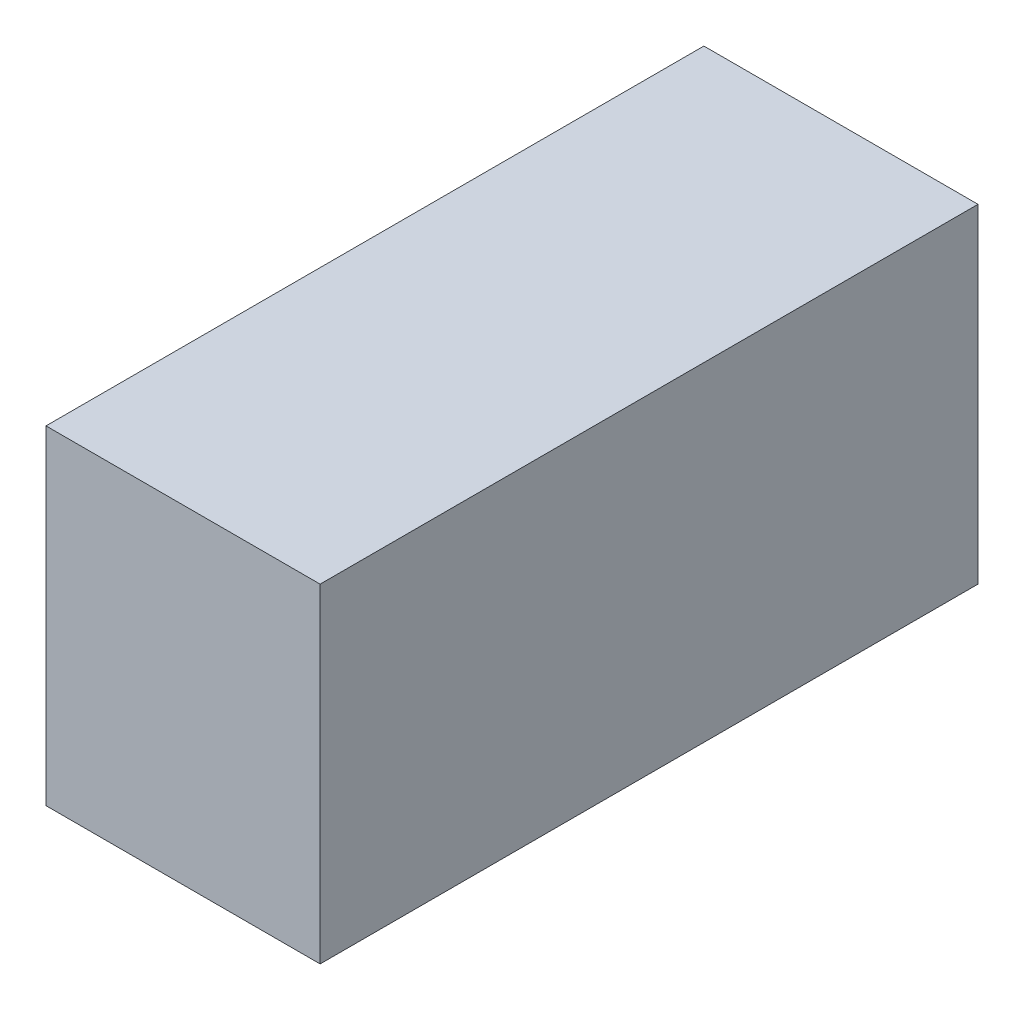
ISO-10303-21;
HEADER;
FILE_DESCRIPTION(('STEP AP214'),'2;1');
FILE_NAME('part.step','',(''),(''),'','','');
FILE_SCHEMA(('AUTOMOTIVE_DESIGN { 1 0 10303 214 1 1 1 1 }'));
ENDSEC;
DATA;
#1=APPLICATION_CONTEXT('core data for automotive mechanical design processes');
#2=APPLICATION_PROTOCOL_DEFINITION('international standard','automotive_design',2000,#1);
#3=PRODUCT_CONTEXT('',#1,'mechanical');
#4=PRODUCT('Part','Part','',(#3));
#5=PRODUCT_RELATED_PRODUCT_CATEGORY('part','',(#4));
#6=PRODUCT_DEFINITION_FORMATION('','',#4);
#7=PRODUCT_DEFINITION_CONTEXT('part definition',#1,'design');
#8=PRODUCT_DEFINITION('design','',#6,#7);
#9=PRODUCT_DEFINITION_SHAPE('','',#8);
#10=(LENGTH_UNIT() NAMED_UNIT(*) SI_UNIT(.MILLI.,.METRE.));
#11=(NAMED_UNIT(*) PLANE_ANGLE_UNIT() SI_UNIT($,.RADIAN.));
#12=(NAMED_UNIT(*) SI_UNIT($,.STERADIAN.) SOLID_ANGLE_UNIT());
#13=UNCERTAINTY_MEASURE_WITH_UNIT(LENGTH_MEASURE(1.E-05),#10,'distance_accuracy_value','');
#14=(GEOMETRIC_REPRESENTATION_CONTEXT(3) GLOBAL_UNCERTAINTY_ASSIGNED_CONTEXT((#13)) GLOBAL_UNIT_ASSIGNED_CONTEXT((#10,
#11,#12)) REPRESENTATION_CONTEXT('',''));
#15=CARTESIAN_POINT('',(0.,0.,0.));
#16=DIRECTION('',(0.,0.,1.));
#17=DIRECTION('',(1.,0.,0.));
#18=AXIS2_PLACEMENT_3D('',#15,#16,#17);
#19=CARTESIAN_POINT('',(125.,0.,0.));
#20=DIRECTION('',(0.,0.,-1.));
#21=DIRECTION('',(-1.,0.,0.));
#22=AXIS2_PLACEMENT_3D('',#19,#20,#21);
#23=PLANE('',#22);
#24=DIRECTION('',(0.,-1.,0.));
#25=VECTOR('',#24,1.);
#26=CARTESIAN_POINT('',(0.,0.,0.));
#27=LINE('',#26,#25);
#28=CARTESIAN_POINT('',(0.,150.,0.));
#29=VERTEX_POINT('',#28);
#30=CARTESIAN_POINT('',(0.,0.,0.));
#31=VERTEX_POINT('',#30);
#32=EDGE_CURVE('E100',#29,#31,#27,.T.);
#33=ORIENTED_EDGE('',*,*,#32,.T.);
#34=DIRECTION('',(-1.,0.,0.));
#35=VECTOR('',#34,1.);
#36=CARTESIAN_POINT('',(125.,0.,0.));
#37=LINE('',#36,#35);
#38=CARTESIAN_POINT('',(125.,0.,0.));
#39=VERTEX_POINT('',#38);
#40=EDGE_CURVE('E11',#39,#31,#37,.T.);
#41=ORIENTED_EDGE('',*,*,#40,.F.);
#42=DIRECTION('',(0.,-1.,0.));
#43=VECTOR('',#42,1.);
#44=CARTESIAN_POINT('',(125.,0.,0.));
#45=LINE('',#44,#43);
#46=CARTESIAN_POINT('',(125.,150.,0.));
#47=VERTEX_POINT('',#46);
#48=EDGE_CURVE('E88',#47,#39,#45,.T.);
#49=ORIENTED_EDGE('',*,*,#48,.F.);
#50=DIRECTION('',(-1.,0.,0.));
#51=VECTOR('',#50,1.);
#52=CARTESIAN_POINT('',(125.,150.,0.));
#53=LINE('',#52,#51);
#54=EDGE_CURVE('E96',#47,#29,#53,.T.);
#55=ORIENTED_EDGE('',*,*,#54,.T.);
#56=EDGE_LOOP('',(#33,#41,#49,#55));
#57=FACE_BOUND('',#56,.T.);
#58=ADVANCED_FACE('F37',(#57),#23,.F.);
#59=CARTESIAN_POINT('',(125.,0.,0.));
#60=DIRECTION('',(0.,1.,0.));
#61=DIRECTION('',(0.,0.,1.));
#62=AXIS2_PLACEMENT_3D('',#59,#60,#61);
#63=PLANE('',#62);
#64=DIRECTION('',(0.,0.,-1.));
#65=VECTOR('',#64,1.);
#66=CARTESIAN_POINT('',(0.,0.,0.));
#67=LINE('',#66,#65);
#68=CARTESIAN_POINT('',(0.,0.,-300.));
#69=VERTEX_POINT('',#68);
#70=EDGE_CURVE('E92',#31,#69,#67,.T.);
#71=ORIENTED_EDGE('',*,*,#70,.T.);
#72=DIRECTION('',(-1.,0.,0.));
#73=VECTOR('',#72,1.);
#74=CARTESIAN_POINT('',(125.,0.,-300.));
#75=LINE('',#74,#73);
#76=CARTESIAN_POINT('',(125.,0.,-300.));
#77=VERTEX_POINT('',#76);
#78=EDGE_CURVE('E45',#77,#69,#75,.T.);
#79=ORIENTED_EDGE('',*,*,#78,.F.);
#80=DIRECTION('',(0.,0.,-1.));
#81=VECTOR('',#80,1.);
#82=CARTESIAN_POINT('',(125.,0.,0.));
#83=LINE('',#82,#81);
#84=EDGE_CURVE('E83',#39,#77,#83,.T.);
#85=ORIENTED_EDGE('',*,*,#84,.F.);
#86=ORIENTED_EDGE('',*,*,#40,.T.);
#87=EDGE_LOOP('',(#71,#79,#85,#86));
#88=FACE_BOUND('',#87,.T.);
#89=ADVANCED_FACE('F91',(#88),#63,.F.);
#90=CARTESIAN_POINT('',(125.,0.,-300.));
#91=DIRECTION('',(0.,0.,1.));
#92=DIRECTION('',(1.,0.,0.));
#93=AXIS2_PLACEMENT_3D('',#90,#91,#92);
#94=PLANE('',#93);
#95=DIRECTION('',(0.,1.,0.));
#96=VECTOR('',#95,1.);
#97=CARTESIAN_POINT('',(0.,0.,-300.));
#98=LINE('',#97,#96);
#99=CARTESIAN_POINT('',(0.,150.,-300.));
#100=VERTEX_POINT('',#99);
#101=EDGE_CURVE('E70',#69,#100,#98,.T.);
#102=ORIENTED_EDGE('',*,*,#101,.T.);
#103=DIRECTION('',(-1.,0.,0.));
#104=VECTOR('',#103,1.);
#105=CARTESIAN_POINT('',(125.,150.,-300.));
#106=LINE('',#105,#104);
#107=CARTESIAN_POINT('',(125.,150.,-300.));
#108=VERTEX_POINT('',#107);
#109=EDGE_CURVE('E93',#108,#100,#106,.T.);
#110=ORIENTED_EDGE('',*,*,#109,.F.);
#111=DIRECTION('',(0.,1.,0.));
#112=VECTOR('',#111,1.);
#113=CARTESIAN_POINT('',(125.,0.,-300.));
#114=LINE('',#113,#112);
#115=EDGE_CURVE('E86',#77,#108,#114,.T.);
#116=ORIENTED_EDGE('',*,*,#115,.F.);
#117=ORIENTED_EDGE('',*,*,#78,.T.);
#118=EDGE_LOOP('',(#102,#110,#116,#117));
#119=FACE_BOUND('',#118,.T.);
#120=ADVANCED_FACE('F94',(#119),#94,.F.);
#121=CARTESIAN_POINT('',(125.,150.,0.));
#122=DIRECTION('',(0.,-1.,0.));
#123=DIRECTION('',(0.,0.,-1.));
#124=AXIS2_PLACEMENT_3D('',#121,#122,#123);
#125=PLANE('',#124);
#126=DIRECTION('',(0.,0.,1.));
#127=VECTOR('',#126,1.);
#128=CARTESIAN_POINT('',(0.,150.,0.));
#129=LINE('',#128,#127);
#130=EDGE_CURVE('E76',#100,#29,#129,.T.);
#131=ORIENTED_EDGE('',*,*,#130,.T.);
#132=ORIENTED_EDGE('',*,*,#54,.F.);
#133=DIRECTION('',(0.,0.,1.));
#134=VECTOR('',#133,1.);
#135=CARTESIAN_POINT('',(125.,150.,0.));
#136=LINE('',#135,#134);
#137=EDGE_CURVE('E53',#108,#47,#136,.T.);
#138=ORIENTED_EDGE('',*,*,#137,.F.);
#139=ORIENTED_EDGE('',*,*,#109,.T.);
#140=EDGE_LOOP('',(#131,#132,#138,#139));
#141=FACE_BOUND('',#140,.T.);
#142=ADVANCED_FACE('F107',(#141),#125,.F.);
#143=CARTESIAN_POINT('',(125.,0.,0.));
#144=DIRECTION('',(-1.,0.,0.));
#145=DIRECTION('',(0.,0.,1.));
#146=AXIS2_PLACEMENT_3D('',#143,#144,#145);
#147=PLANE('',#146);
#148=ORIENTED_EDGE('',*,*,#48,.T.);
#149=ORIENTED_EDGE('',*,*,#84,.T.);
#150=ORIENTED_EDGE('',*,*,#115,.T.);
#151=ORIENTED_EDGE('',*,*,#137,.T.);
#152=EDGE_LOOP('',(#148,#149,#150,#151));
#153=FACE_BOUND('',#152,.T.);
#154=ADVANCED_FACE('F84',(#153),#147,.F.);
#155=CARTESIAN_POINT('',(0.,0.,0.));
#156=DIRECTION('',(-1.,0.,0.));
#157=DIRECTION('',(0.,0.,1.));
#158=AXIS2_PLACEMENT_3D('',#155,#156,#157);
#159=PLANE('',#158);
#160=ORIENTED_EDGE('',*,*,#32,.F.);
#161=ORIENTED_EDGE('',*,*,#130,.F.);
#162=ORIENTED_EDGE('',*,*,#101,.F.);
#163=ORIENTED_EDGE('',*,*,#70,.F.);
#164=EDGE_LOOP('',(#160,#161,#162,#163));
#165=FACE_BOUND('',#164,.T.);
#166=ADVANCED_FACE('F110',(#165),#159,.T.);
#167=CLOSED_SHELL('',(#58,#89,#120,#142,#154,#166));
#168=MANIFOLD_SOLID_BREP('B2',#167);
#169=ADVANCED_BREP_SHAPE_REPRESENTATION('',(#18,#168),#14);
#170=SHAPE_DEFINITION_REPRESENTATION(#9,#169);
ENDSEC;
END-ISO-10303-21;
